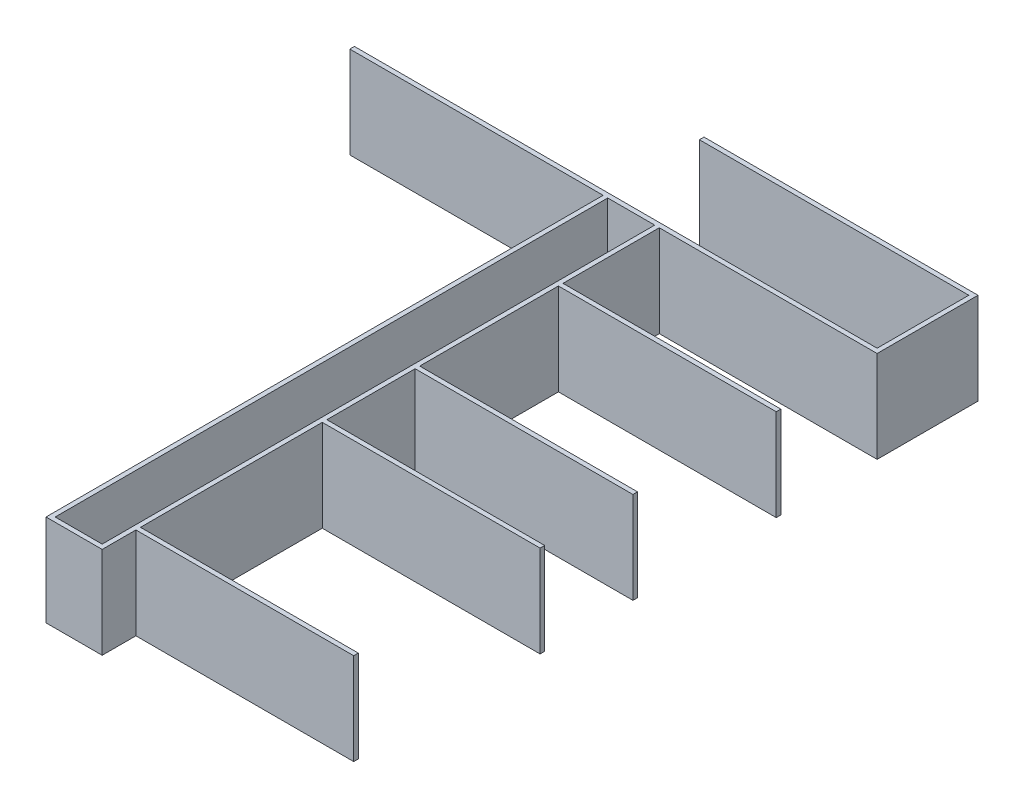
ISO-10303-21;
HEADER;
FILE_DESCRIPTION(('STEP AP214'),'2;1');
FILE_NAME('part.step','',(''),(''),'','','');
FILE_SCHEMA(('AUTOMOTIVE_DESIGN { 1 0 10303 214 1 1 1 1 }'));
ENDSEC;
DATA;
#1=APPLICATION_CONTEXT('core data for automotive mechanical design processes');
#2=APPLICATION_PROTOCOL_DEFINITION('international standard','automotive_design',2000,#1);
#3=PRODUCT_CONTEXT('',#1,'mechanical');
#4=PRODUCT('Part','Part','',(#3));
#5=PRODUCT_RELATED_PRODUCT_CATEGORY('part','',(#4));
#6=PRODUCT_DEFINITION_FORMATION('','',#4);
#7=PRODUCT_DEFINITION_CONTEXT('part definition',#1,'design');
#8=PRODUCT_DEFINITION('design','',#6,#7);
#9=PRODUCT_DEFINITION_SHAPE('','',#8);
#10=(LENGTH_UNIT() NAMED_UNIT(*) SI_UNIT(.MILLI.,.METRE.));
#11=(NAMED_UNIT(*) PLANE_ANGLE_UNIT() SI_UNIT($,.RADIAN.));
#12=(NAMED_UNIT(*) SI_UNIT($,.STERADIAN.) SOLID_ANGLE_UNIT());
#13=UNCERTAINTY_MEASURE_WITH_UNIT(LENGTH_MEASURE(1.E-05),#10,'distance_accuracy_value','');
#14=(GEOMETRIC_REPRESENTATION_CONTEXT(3) GLOBAL_UNCERTAINTY_ASSIGNED_CONTEXT((#13)) GLOBAL_UNIT_ASSIGNED_CONTEXT((#10,
#11,#12)) REPRESENTATION_CONTEXT('',''));
#15=CARTESIAN_POINT('',(0.,0.,0.));
#16=DIRECTION('',(0.,0.,1.));
#17=DIRECTION('',(1.,0.,0.));
#18=AXIS2_PLACEMENT_3D('',#15,#16,#17);
#19=CARTESIAN_POINT('',(0.,40.,0.));
#20=DIRECTION('',(-1.,0.,0.));
#21=DIRECTION('',(0.,0.,1.));
#22=AXIS2_PLACEMENT_3D('',#19,#20,#21);
#23=PLANE('',#22);
#24=DIRECTION('',(0.,-1.,0.));
#25=VECTOR('',#24,1.);
#26=CARTESIAN_POINT('',(0.,40.,-199.));
#27=LINE('',#26,#25);
#28=CARTESIAN_POINT('',(0.,40.,-199.));
#29=VERTEX_POINT('',#28);
#30=CARTESIAN_POINT('',(0.,0.,-199.));
#31=VERTEX_POINT('',#30);
#32=EDGE_CURVE('E12',#29,#31,#27,.T.);
#33=ORIENTED_EDGE('',*,*,#32,.F.);
#34=DIRECTION('',(0.,0.,-1.));
#35=VECTOR('',#34,1.);
#36=CARTESIAN_POINT('',(0.,40.,0.));
#37=LINE('',#36,#35);
#38=CARTESIAN_POINT('',(0.,40.,-138.5));
#39=VERTEX_POINT('',#38);
#40=EDGE_CURVE('E416',#39,#29,#37,.T.);
#41=ORIENTED_EDGE('',*,*,#40,.F.);
#42=DIRECTION('',(0.,-1.,0.));
#43=VECTOR('',#42,1.);
#44=CARTESIAN_POINT('',(0.,40.,-138.5));
#45=LINE('',#44,#43);
#46=CARTESIAN_POINT('',(0.,0.,-138.5));
#47=VERTEX_POINT('',#46);
#48=EDGE_CURVE('E508',#39,#47,#45,.T.);
#49=ORIENTED_EDGE('',*,*,#48,.T.);
#50=DIRECTION('',(0.,0.,-1.));
#51=VECTOR('',#50,1.);
#52=CARTESIAN_POINT('',(0.,0.,0.));
#53=LINE('',#52,#51);
#54=EDGE_CURVE('E479',#47,#31,#53,.T.);
#55=ORIENTED_EDGE('',*,*,#54,.T.);
#56=EDGE_LOOP('',(#33,#41,#49,#55));
#57=FACE_BOUND('',#56,.T.);
#58=ADVANCED_FACE('F131',(#57),#23,.F.);
#59=CARTESIAN_POINT('',(0.,40.,-245.));
#60=DIRECTION('',(0.,0.,1.));
#61=DIRECTION('',(1.,0.,0.));
#62=AXIS2_PLACEMENT_3D('',#59,#60,#61);
#63=PLANE('',#62);
#64=DIRECTION('',(-1.,0.,0.));
#65=VECTOR('',#64,1.);
#66=CARTESIAN_POINT('',(0.,0.,-245.));
#67=LINE('',#66,#65);
#68=CARTESIAN_POINT('',(93.,0.,-245.));
#69=VERTEX_POINT('',#68);
#70=CARTESIAN_POINT('',(-135.,0.,-245.));
#71=VERTEX_POINT('',#70);
#72=EDGE_CURVE('E430',#69,#71,#67,.T.);
#73=ORIENTED_EDGE('',*,*,#72,.T.);
#74=DIRECTION('',(0.,-1.,0.));
#75=VECTOR('',#74,1.);
#76=CARTESIAN_POINT('',(-135.,40.,-245.));
#77=LINE('',#76,#75);
#78=CARTESIAN_POINT('',(-135.,40.,-245.));
#79=VERTEX_POINT('',#78);
#80=EDGE_CURVE('E551',#79,#71,#77,.T.);
#81=ORIENTED_EDGE('',*,*,#80,.F.);
#82=DIRECTION('',(-1.,0.,0.));
#83=VECTOR('',#82,1.);
#84=CARTESIAN_POINT('',(0.,40.,-245.));
#85=LINE('',#84,#83);
#86=CARTESIAN_POINT('',(93.,40.,-245.));
#87=VERTEX_POINT('',#86);
#88=EDGE_CURVE('E367',#87,#79,#85,.T.);
#89=ORIENTED_EDGE('',*,*,#88,.F.);
#90=DIRECTION('',(0.,-1.,0.));
#91=VECTOR('',#90,1.);
#92=CARTESIAN_POINT('',(93.,40.,-245.));
#93=LINE('',#92,#91);
#94=EDGE_CURVE('E429',#87,#69,#93,.T.);
#95=ORIENTED_EDGE('',*,*,#94,.T.);
#96=EDGE_LOOP('',(#73,#81,#89,#95));
#97=FACE_BOUND('',#96,.T.);
#98=ADVANCED_FACE('F645',(#97),#63,.F.);
#99=CARTESIAN_POINT('',(-135.,40.,0.));
#100=DIRECTION('',(1.,0.,0.));
#101=DIRECTION('',(0.,0.,-1.));
#102=AXIS2_PLACEMENT_3D('',#99,#100,#101);
#103=PLANE('',#102);
#104=DIRECTION('',(0.,0.,1.));
#105=VECTOR('',#104,1.);
#106=CARTESIAN_POINT('',(-135.,0.,0.));
#107=LINE('',#106,#105);
#108=CARTESIAN_POINT('',(-135.,0.,-243.));
#109=VERTEX_POINT('',#108);
#110=EDGE_CURVE('E433',#71,#109,#107,.T.);
#111=ORIENTED_EDGE('',*,*,#110,.T.);
#112=DIRECTION('',(0.,-1.,0.));
#113=VECTOR('',#112,1.);
#114=CARTESIAN_POINT('',(-135.,40.,-243.));
#115=LINE('',#114,#113);
#116=CARTESIAN_POINT('',(-135.,40.,-243.));
#117=VERTEX_POINT('',#116);
#118=EDGE_CURVE('E549',#117,#109,#115,.T.);
#119=ORIENTED_EDGE('',*,*,#118,.F.);
#120=DIRECTION('',(0.,0.,1.));
#121=VECTOR('',#120,1.);
#122=CARTESIAN_POINT('',(-135.,40.,0.));
#123=LINE('',#122,#121);
#124=EDGE_CURVE('E370',#79,#117,#123,.T.);
#125=ORIENTED_EDGE('',*,*,#124,.F.);
#126=ORIENTED_EDGE('',*,*,#80,.T.);
#127=EDGE_LOOP('',(#111,#119,#125,#126));
#128=FACE_BOUND('',#127,.T.);
#129=ADVANCED_FACE('F647',(#128),#103,.F.);
#130=CARTESIAN_POINT('',(0.,40.,-243.));
#131=DIRECTION('',(0.,0.,1.));
#132=DIRECTION('',(1.,0.,0.));
#133=AXIS2_PLACEMENT_3D('',#130,#131,#132);
#134=PLANE('',#133);
#135=DIRECTION('',(-1.,0.,0.));
#136=VECTOR('',#135,1.);
#137=CARTESIAN_POINT('',(0.,0.,-243.));
#138=LINE('',#137,#136);
#139=CARTESIAN_POINT('',(-24.5,0.,-243.));
#140=VERTEX_POINT('',#139);
#141=EDGE_CURVE('E437',#140,#109,#138,.T.);
#142=ORIENTED_EDGE('',*,*,#141,.F.);
#143=DIRECTION('',(0.,-1.,0.));
#144=VECTOR('',#143,1.);
#145=CARTESIAN_POINT('',(-24.5,40.,-243.));
#146=LINE('',#145,#144);
#147=CARTESIAN_POINT('',(-24.5,40.,-243.));
#148=VERTEX_POINT('',#147);
#149=EDGE_CURVE('E547',#148,#140,#146,.T.);
#150=ORIENTED_EDGE('',*,*,#149,.F.);
#151=DIRECTION('',(-1.,0.,0.));
#152=VECTOR('',#151,1.);
#153=CARTESIAN_POINT('',(0.,40.,-243.));
#154=LINE('',#153,#152);
#155=EDGE_CURVE('E373',#148,#117,#154,.T.);
#156=ORIENTED_EDGE('',*,*,#155,.T.);
#157=ORIENTED_EDGE('',*,*,#118,.T.);
#158=EDGE_LOOP('',(#142,#150,#156,#157));
#159=FACE_BOUND('',#158,.T.);
#160=ADVANCED_FACE('F654',(#159),#134,.T.);
#161=CARTESIAN_POINT('',(-24.4999999999999,40.,0.));
#162=DIRECTION('',(1.,0.,0.));
#163=DIRECTION('',(0.,0.,-1.));
#164=AXIS2_PLACEMENT_3D('',#161,#162,#163);
#165=PLANE('',#164);
#166=DIRECTION('',(0.,0.,1.));
#167=VECTOR('',#166,1.);
#168=CARTESIAN_POINT('',(-24.4999999999999,0.,0.));
#169=LINE('',#168,#167);
#170=CARTESIAN_POINT('',(-24.4999999999999,0.,0.));
#171=VERTEX_POINT('',#170);
#172=EDGE_CURVE('E352',#140,#171,#169,.T.);
#173=ORIENTED_EDGE('',*,*,#172,.T.);
#174=DIRECTION('',(0.,-1.,0.));
#175=VECTOR('',#174,1.);
#176=CARTESIAN_POINT('',(-24.4999999999999,40.,0.));
#177=LINE('',#176,#175);
#178=CARTESIAN_POINT('',(-24.4999999999999,40.,0.));
#179=VERTEX_POINT('',#178);
#180=EDGE_CURVE('E544',#179,#171,#177,.T.);
#181=ORIENTED_EDGE('',*,*,#180,.F.);
#182=DIRECTION('',(0.,0.,1.));
#183=VECTOR('',#182,1.);
#184=CARTESIAN_POINT('',(-24.4999999999999,40.,0.));
#185=LINE('',#184,#183);
#186=EDGE_CURVE('E376',#148,#179,#185,.T.);
#187=ORIENTED_EDGE('',*,*,#186,.F.);
#188=ORIENTED_EDGE('',*,*,#149,.T.);
#189=EDGE_LOOP('',(#173,#181,#187,#188));
#190=FACE_BOUND('',#189,.T.);
#191=ADVANCED_FACE('F657',(#190),#165,.F.);
#192=CARTESIAN_POINT('',(-22.5,40.,0.));
#193=DIRECTION('',(-1.,0.,0.));
#194=DIRECTION('',(0.,0.,1.));
#195=AXIS2_PLACEMENT_3D('',#192,#193,#194);
#196=PLANE('',#195);
#197=DIRECTION('',(0.,0.,-1.));
#198=VECTOR('',#197,1.);
#199=CARTESIAN_POINT('',(-22.5,40.,0.));
#200=LINE('',#199,#198);
#201=CARTESIAN_POINT('',(-22.5,40.,-1.99999999999999));
#202=VERTEX_POINT('',#201);
#203=CARTESIAN_POINT('',(-22.5,40.,-243.));
#204=VERTEX_POINT('',#203);
#205=EDGE_CURVE('E156',#202,#204,#200,.T.);
#206=ORIENTED_EDGE('',*,*,#205,.F.);
#207=DIRECTION('',(0.,-1.,0.));
#208=VECTOR('',#207,1.);
#209=CARTESIAN_POINT('',(-22.5,40.,-1.99999999999999));
#210=LINE('',#209,#208);
#211=CARTESIAN_POINT('',(-22.5,0.,-1.99999999999999));
#212=VERTEX_POINT('',#211);
#213=EDGE_CURVE('E354',#202,#212,#210,.T.);
#214=ORIENTED_EDGE('',*,*,#213,.T.);
#215=DIRECTION('',(0.,0.,-1.));
#216=VECTOR('',#215,1.);
#217=CARTESIAN_POINT('',(-22.5,0.,0.));
#218=LINE('',#217,#216);
#219=CARTESIAN_POINT('',(-22.5,0.,-243.));
#220=VERTEX_POINT('',#219);
#221=EDGE_CURVE('E343',#212,#220,#218,.T.);
#222=ORIENTED_EDGE('',*,*,#221,.T.);
#223=DIRECTION('',(0.,-1.,0.));
#224=VECTOR('',#223,1.);
#225=CARTESIAN_POINT('',(-22.5,40.,-243.));
#226=LINE('',#225,#224);
#227=EDGE_CURVE('E542',#204,#220,#226,.T.);
#228=ORIENTED_EDGE('',*,*,#227,.F.);
#229=EDGE_LOOP('',(#206,#214,#222,#228));
#230=FACE_BOUND('',#229,.T.);
#231=ADVANCED_FACE('F355',(#230),#196,.F.);
#232=CARTESIAN_POINT('',(0.,40.,-243.));
#233=DIRECTION('',(0.,0.,1.));
#234=DIRECTION('',(1.,0.,0.));
#235=AXIS2_PLACEMENT_3D('',#232,#233,#234);
#236=PLANE('',#235);
#237=DIRECTION('',(-1.,0.,0.));
#238=VECTOR('',#237,1.);
#239=CARTESIAN_POINT('',(0.,0.,-243.));
#240=LINE('',#239,#238);
#241=CARTESIAN_POINT('',(-2.,0.,-243.));
#242=VERTEX_POINT('',#241);
#243=EDGE_CURVE('E350',#242,#220,#240,.T.);
#244=ORIENTED_EDGE('',*,*,#243,.F.);
#245=DIRECTION('',(0.,-1.,0.));
#246=VECTOR('',#245,1.);
#247=CARTESIAN_POINT('',(-2.,40.,-243.));
#248=LINE('',#247,#246);
#249=CARTESIAN_POINT('',(-2.,40.,-243.));
#250=VERTEX_POINT('',#249);
#251=EDGE_CURVE('E540',#250,#242,#248,.T.);
#252=ORIENTED_EDGE('',*,*,#251,.F.);
#253=DIRECTION('',(-1.,0.,0.));
#254=VECTOR('',#253,1.);
#255=CARTESIAN_POINT('',(0.,40.,-243.));
#256=LINE('',#255,#254);
#257=EDGE_CURVE('E382',#250,#204,#256,.T.);
#258=ORIENTED_EDGE('',*,*,#257,.T.);
#259=ORIENTED_EDGE('',*,*,#227,.T.);
#260=EDGE_LOOP('',(#244,#252,#258,#259));
#261=FACE_BOUND('',#260,.T.);
#262=ADVANCED_FACE('F708',(#261),#236,.T.);
#263=CARTESIAN_POINT('',(-1.99999999999997,40.,0.));
#264=DIRECTION('',(1.,0.,0.));
#265=DIRECTION('',(0.,0.,-1.));
#266=AXIS2_PLACEMENT_3D('',#263,#264,#265);
#267=PLANE('',#266);
#268=DIRECTION('',(0.,0.,1.));
#269=VECTOR('',#268,1.);
#270=CARTESIAN_POINT('',(-1.99999999999997,0.,0.));
#271=LINE('',#270,#269);
#272=CARTESIAN_POINT('',(-1.99999999999997,0.,-1.99999999999999));
#273=VERTEX_POINT('',#272);
#274=EDGE_CURVE('E443',#242,#273,#271,.T.);
#275=ORIENTED_EDGE('',*,*,#274,.T.);
#276=DIRECTION('',(0.,-1.,0.));
#277=VECTOR('',#276,1.);
#278=CARTESIAN_POINT('',(-1.99999999999997,40.,-1.99999999999999));
#279=LINE('',#278,#277);
#280=CARTESIAN_POINT('',(-1.99999999999997,40.,-1.99999999999999));
#281=VERTEX_POINT('',#280);
#282=EDGE_CURVE('E148',#281,#273,#279,.T.);
#283=ORIENTED_EDGE('',*,*,#282,.F.);
#284=DIRECTION('',(0.,0.,1.));
#285=VECTOR('',#284,1.);
#286=CARTESIAN_POINT('',(-1.99999999999997,40.,0.));
#287=LINE('',#286,#285);
#288=EDGE_CURVE('E385',#250,#281,#287,.T.);
#289=ORIENTED_EDGE('',*,*,#288,.F.);
#290=ORIENTED_EDGE('',*,*,#251,.T.);
#291=EDGE_LOOP('',(#275,#283,#289,#290));
#292=FACE_BOUND('',#291,.T.);
#293=ADVANCED_FACE('F711',(#292),#267,.F.);
#294=CARTESIAN_POINT('',(0.,40.,0.));
#295=DIRECTION('',(0.,0.,1.));
#296=DIRECTION('',(1.,0.,0.));
#297=AXIS2_PLACEMENT_3D('',#294,#295,#296);
#298=PLANE('',#297);
#299=DIRECTION('',(-1.,0.,0.));
#300=VECTOR('',#299,1.);
#301=CARTESIAN_POINT('',(0.,0.,0.));
#302=LINE('',#301,#300);
#303=CARTESIAN_POINT('',(0.,0.,0.));
#304=VERTEX_POINT('',#303);
#305=EDGE_CURVE('E445',#304,#171,#302,.T.);
#306=ORIENTED_EDGE('',*,*,#305,.F.);
#307=DIRECTION('',(0.,-1.,0.));
#308=VECTOR('',#307,1.);
#309=CARTESIAN_POINT('',(0.,40.,0.));
#310=LINE('',#309,#308);
#311=CARTESIAN_POINT('',(0.,40.,0.));
#312=VERTEX_POINT('',#311);
#313=EDGE_CURVE('E538',#312,#304,#310,.T.);
#314=ORIENTED_EDGE('',*,*,#313,.F.);
#315=DIRECTION('',(-1.,0.,0.));
#316=VECTOR('',#315,1.);
#317=CARTESIAN_POINT('',(0.,40.,0.));
#318=LINE('',#317,#316);
#319=EDGE_CURVE('E378',#312,#179,#318,.T.);
#320=ORIENTED_EDGE('',*,*,#319,.T.);
#321=ORIENTED_EDGE('',*,*,#180,.T.);
#322=EDGE_LOOP('',(#306,#314,#320,#321));
#323=FACE_BOUND('',#322,.T.);
#324=ADVANCED_FACE('F661',(#323),#298,.T.);
#325=CARTESIAN_POINT('',(0.,0.,-14.7));
#326=VERTEX_POINT('',#325);
#327=EDGE_CURVE('E447',#304,#326,#53,.T.);
#328=ORIENTED_EDGE('',*,*,#327,.T.);
#329=DIRECTION('',(0.,-1.,0.));
#330=VECTOR('',#329,1.);
#331=CARTESIAN_POINT('',(0.,40.,-14.7));
#332=LINE('',#331,#330);
#333=CARTESIAN_POINT('',(0.,40.,-14.7));
#334=VERTEX_POINT('',#333);
#335=EDGE_CURVE('E535',#334,#326,#332,.T.);
#336=ORIENTED_EDGE('',*,*,#335,.F.);
#337=EDGE_CURVE('E387',#312,#334,#37,.T.);
#338=ORIENTED_EDGE('',*,*,#337,.F.);
#339=ORIENTED_EDGE('',*,*,#313,.T.);
#340=EDGE_LOOP('',(#328,#336,#338,#339));
#341=FACE_BOUND('',#340,.T.);
#342=ADVANCED_FACE('F667',(#341),#23,.F.);
#343=CARTESIAN_POINT('',(0.,40.,-14.7));
#344=DIRECTION('',(0.,0.,-1.));
#345=DIRECTION('',(-1.,0.,0.));
#346=AXIS2_PLACEMENT_3D('',#343,#344,#345);
#347=PLANE('',#346);
#348=DIRECTION('',(1.,0.,0.));
#349=VECTOR('',#348,1.);
#350=CARTESIAN_POINT('',(0.,0.,-14.7));
#351=LINE('',#350,#349);
#352=CARTESIAN_POINT('',(95.,0.,-14.7));
#353=VERTEX_POINT('',#352);
#354=EDGE_CURVE('E449',#326,#353,#351,.T.);
#355=ORIENTED_EDGE('',*,*,#354,.T.);
#356=DIRECTION('',(0.,-1.,0.));
#357=VECTOR('',#356,1.);
#358=CARTESIAN_POINT('',(95.,40.,-14.7));
#359=LINE('',#358,#357);
#360=CARTESIAN_POINT('',(95.,40.,-14.7));
#361=VERTEX_POINT('',#360);
#362=EDGE_CURVE('E532',#361,#353,#359,.T.);
#363=ORIENTED_EDGE('',*,*,#362,.F.);
#364=DIRECTION('',(1.,0.,0.));
#365=VECTOR('',#364,1.);
#366=CARTESIAN_POINT('',(0.,40.,-14.7));
#367=LINE('',#366,#365);
#368=EDGE_CURVE('E389',#334,#361,#367,.T.);
#369=ORIENTED_EDGE('',*,*,#368,.F.);
#370=ORIENTED_EDGE('',*,*,#335,.T.);
#371=EDGE_LOOP('',(#355,#363,#369,#370));
#372=FACE_BOUND('',#371,.T.);
#373=ADVANCED_FACE('F671',(#372),#347,.F.);
#374=CARTESIAN_POINT('',(95.,40.,0.));
#375=DIRECTION('',(-1.,0.,0.));
#376=DIRECTION('',(0.,0.,1.));
#377=AXIS2_PLACEMENT_3D('',#374,#375,#376);
#378=PLANE('',#377);
#379=DIRECTION('',(0.,0.,-1.));
#380=VECTOR('',#379,1.);
#381=CARTESIAN_POINT('',(95.,0.,0.));
#382=LINE('',#381,#380);
#383=CARTESIAN_POINT('',(95.,0.,-16.7));
#384=VERTEX_POINT('',#383);
#385=EDGE_CURVE('E453',#353,#384,#382,.T.);
#386=ORIENTED_EDGE('',*,*,#385,.T.);
#387=DIRECTION('',(0.,-1.,0.));
#388=VECTOR('',#387,1.);
#389=CARTESIAN_POINT('',(95.,40.,-16.7));
#390=LINE('',#389,#388);
#391=CARTESIAN_POINT('',(95.,40.,-16.7));
#392=VERTEX_POINT('',#391);
#393=EDGE_CURVE('E530',#392,#384,#390,.T.);
#394=ORIENTED_EDGE('',*,*,#393,.F.);
#395=DIRECTION('',(0.,0.,-1.));
#396=VECTOR('',#395,1.);
#397=CARTESIAN_POINT('',(95.,40.,0.));
#398=LINE('',#397,#396);
#399=EDGE_CURVE('E393',#361,#392,#398,.T.);
#400=ORIENTED_EDGE('',*,*,#399,.F.);
#401=ORIENTED_EDGE('',*,*,#362,.T.);
#402=EDGE_LOOP('',(#386,#394,#400,#401));
#403=FACE_BOUND('',#402,.T.);
#404=ADVANCED_FACE('F676',(#403),#378,.F.);
#405=CARTESIAN_POINT('',(0.,40.,-16.7));
#406=DIRECTION('',(0.,0.,-1.));
#407=DIRECTION('',(-1.,0.,0.));
#408=AXIS2_PLACEMENT_3D('',#405,#406,#407);
#409=PLANE('',#408);
#410=DIRECTION('',(1.,0.,0.));
#411=VECTOR('',#410,1.);
#412=CARTESIAN_POINT('',(0.,0.,-16.7));
#413=LINE('',#412,#411);
#414=CARTESIAN_POINT('',(0.,0.,-16.7));
#415=VERTEX_POINT('',#414);
#416=EDGE_CURVE('E456',#415,#384,#413,.T.);
#417=ORIENTED_EDGE('',*,*,#416,.F.);
#418=DIRECTION('',(0.,-1.,0.));
#419=VECTOR('',#418,1.);
#420=CARTESIAN_POINT('',(0.,40.,-16.7));
#421=LINE('',#420,#419);
#422=CARTESIAN_POINT('',(0.,40.,-16.7));
#423=VERTEX_POINT('',#422);
#424=EDGE_CURVE('E528',#423,#415,#421,.T.);
#425=ORIENTED_EDGE('',*,*,#424,.F.);
#426=DIRECTION('',(1.,0.,0.));
#427=VECTOR('',#426,1.);
#428=CARTESIAN_POINT('',(0.,40.,-16.7));
#429=LINE('',#428,#427);
#430=EDGE_CURVE('E395',#423,#392,#429,.T.);
#431=ORIENTED_EDGE('',*,*,#430,.T.);
#432=ORIENTED_EDGE('',*,*,#393,.T.);
#433=EDGE_LOOP('',(#417,#425,#431,#432));
#434=FACE_BOUND('',#433,.T.);
#435=ADVANCED_FACE('F678',(#434),#409,.T.);
#436=CARTESIAN_POINT('',(0.,0.,-96.));
#437=VERTEX_POINT('',#436);
#438=EDGE_CURVE('E451',#415,#437,#53,.T.);
#439=ORIENTED_EDGE('',*,*,#438,.T.);
#440=DIRECTION('',(0.,-1.,0.));
#441=VECTOR('',#440,1.);
#442=CARTESIAN_POINT('',(0.,40.,-96.));
#443=LINE('',#442,#441);
#444=CARTESIAN_POINT('',(0.,40.,-96.));
#445=VERTEX_POINT('',#444);
#446=EDGE_CURVE('E525',#445,#437,#443,.T.);
#447=ORIENTED_EDGE('',*,*,#446,.F.);
#448=EDGE_CURVE('E391',#423,#445,#37,.T.);
#449=ORIENTED_EDGE('',*,*,#448,.F.);
#450=ORIENTED_EDGE('',*,*,#424,.T.);
#451=EDGE_LOOP('',(#439,#447,#449,#450));
#452=FACE_BOUND('',#451,.T.);
#453=ADVANCED_FACE('F594',(#452),#23,.F.);
#454=CARTESIAN_POINT('',(0.,40.,-96.));
#455=DIRECTION('',(0.,0.,-1.));
#456=DIRECTION('',(-1.,0.,0.));
#457=AXIS2_PLACEMENT_3D('',#454,#455,#456);
#458=PLANE('',#457);
#459=DIRECTION('',(1.,0.,0.));
#460=VECTOR('',#459,1.);
#461=CARTESIAN_POINT('',(0.,0.,-96.));
#462=LINE('',#461,#460);
#463=CARTESIAN_POINT('',(95.,0.,-96.));
#464=VERTEX_POINT('',#463);
#465=EDGE_CURVE('E459',#437,#464,#462,.T.);
#466=ORIENTED_EDGE('',*,*,#465,.T.);
#467=DIRECTION('',(0.,-1.,0.));
#468=VECTOR('',#467,1.);
#469=CARTESIAN_POINT('',(95.,40.,-96.));
#470=LINE('',#469,#468);
#471=CARTESIAN_POINT('',(95.,40.,-96.));
#472=VERTEX_POINT('',#471);
#473=EDGE_CURVE('E522',#472,#464,#470,.T.);
#474=ORIENTED_EDGE('',*,*,#473,.F.);
#475=DIRECTION('',(1.,0.,0.));
#476=VECTOR('',#475,1.);
#477=CARTESIAN_POINT('',(0.,40.,-96.));
#478=LINE('',#477,#476);
#479=EDGE_CURVE('E398',#445,#472,#478,.T.);
#480=ORIENTED_EDGE('',*,*,#479,.F.);
#481=ORIENTED_EDGE('',*,*,#446,.T.);
#482=EDGE_LOOP('',(#466,#474,#480,#481));
#483=FACE_BOUND('',#482,.T.);
#484=ADVANCED_FACE('F600',(#483),#458,.F.);
#485=CARTESIAN_POINT('',(95.,40.,0.));
#486=DIRECTION('',(-1.,0.,0.));
#487=DIRECTION('',(0.,0.,1.));
#488=AXIS2_PLACEMENT_3D('',#485,#486,#487);
#489=PLANE('',#488);
#490=DIRECTION('',(0.,0.,-1.));
#491=VECTOR('',#490,1.);
#492=CARTESIAN_POINT('',(95.,0.,0.));
#493=LINE('',#492,#491);
#494=CARTESIAN_POINT('',(95.,0.,-98.));
#495=VERTEX_POINT('',#494);
#496=EDGE_CURVE('E461',#464,#495,#493,.T.);
#497=ORIENTED_EDGE('',*,*,#496,.T.);
#498=DIRECTION('',(0.,-1.,0.));
#499=VECTOR('',#498,1.);
#500=CARTESIAN_POINT('',(95.,40.,-98.));
#501=LINE('',#500,#499);
#502=CARTESIAN_POINT('',(95.,40.,-98.));
#503=VERTEX_POINT('',#502);
#504=EDGE_CURVE('E520',#503,#495,#501,.T.);
#505=ORIENTED_EDGE('',*,*,#504,.F.);
#506=DIRECTION('',(0.,0.,-1.));
#507=VECTOR('',#506,1.);
#508=CARTESIAN_POINT('',(95.,40.,0.));
#509=LINE('',#508,#507);
#510=EDGE_CURVE('E400',#472,#503,#509,.T.);
#511=ORIENTED_EDGE('',*,*,#510,.F.);
#512=ORIENTED_EDGE('',*,*,#473,.T.);
#513=EDGE_LOOP('',(#497,#505,#511,#512));
#514=FACE_BOUND('',#513,.T.);
#515=ADVANCED_FACE('F606',(#514),#489,.F.);
#516=CARTESIAN_POINT('',(0.,40.,-98.));
#517=DIRECTION('',(0.,0.,-1.));
#518=DIRECTION('',(-1.,0.,0.));
#519=AXIS2_PLACEMENT_3D('',#516,#517,#518);
#520=PLANE('',#519);
#521=DIRECTION('',(1.,0.,0.));
#522=VECTOR('',#521,1.);
#523=CARTESIAN_POINT('',(0.,0.,-98.));
#524=LINE('',#523,#522);
#525=CARTESIAN_POINT('',(0.,0.,-98.));
#526=VERTEX_POINT('',#525);
#527=EDGE_CURVE('E464',#526,#495,#524,.T.);
#528=ORIENTED_EDGE('',*,*,#527,.F.);
#529=DIRECTION('',(0.,-1.,0.));
#530=VECTOR('',#529,1.);
#531=CARTESIAN_POINT('',(0.,40.,-98.));
#532=LINE('',#531,#530);
#533=CARTESIAN_POINT('',(0.,40.,-98.));
#534=VERTEX_POINT('',#533);
#535=EDGE_CURVE('E518',#534,#526,#532,.T.);
#536=ORIENTED_EDGE('',*,*,#535,.F.);
#537=DIRECTION('',(1.,0.,0.));
#538=VECTOR('',#537,1.);
#539=CARTESIAN_POINT('',(0.,40.,-98.));
#540=LINE('',#539,#538);
#541=EDGE_CURVE('E402',#534,#503,#540,.T.);
#542=ORIENTED_EDGE('',*,*,#541,.T.);
#543=ORIENTED_EDGE('',*,*,#504,.T.);
#544=EDGE_LOOP('',(#528,#536,#542,#543));
#545=FACE_BOUND('',#544,.T.);
#546=ADVANCED_FACE('F727',(#545),#520,.T.);
#547=CARTESIAN_POINT('',(0.,0.,-136.5));
#548=VERTEX_POINT('',#547);
#549=EDGE_CURVE('E467',#526,#548,#53,.T.);
#550=ORIENTED_EDGE('',*,*,#549,.T.);
#551=DIRECTION('',(0.,-1.,0.));
#552=VECTOR('',#551,1.);
#553=CARTESIAN_POINT('',(0.,40.,-136.5));
#554=LINE('',#553,#552);
#555=CARTESIAN_POINT('',(0.,40.,-136.5));
#556=VERTEX_POINT('',#555);
#557=EDGE_CURVE('E515',#556,#548,#554,.T.);
#558=ORIENTED_EDGE('',*,*,#557,.F.);
#559=EDGE_CURVE('E405',#534,#556,#37,.T.);
#560=ORIENTED_EDGE('',*,*,#559,.F.);
#561=ORIENTED_EDGE('',*,*,#535,.T.);
#562=EDGE_LOOP('',(#550,#558,#560,#561));
#563=FACE_BOUND('',#562,.T.);
#564=ADVANCED_FACE('F730',(#563),#23,.F.);
#565=CARTESIAN_POINT('',(0.,40.,-136.5));
#566=DIRECTION('',(0.,0.,-1.));
#567=DIRECTION('',(-1.,0.,0.));
#568=AXIS2_PLACEMENT_3D('',#565,#566,#567);
#569=PLANE('',#568);
#570=DIRECTION('',(1.,0.,0.));
#571=VECTOR('',#570,1.);
#572=CARTESIAN_POINT('',(0.,0.,-136.5));
#573=LINE('',#572,#571);
#574=CARTESIAN_POINT('',(95.,0.,-136.5));
#575=VERTEX_POINT('',#574);
#576=EDGE_CURVE('E468',#548,#575,#573,.T.);
#577=ORIENTED_EDGE('',*,*,#576,.T.);
#578=DIRECTION('',(0.,-1.,0.));
#579=VECTOR('',#578,1.);
#580=CARTESIAN_POINT('',(95.,40.,-136.5));
#581=LINE('',#580,#579);
#582=CARTESIAN_POINT('',(95.,40.,-136.5));
#583=VERTEX_POINT('',#582);
#584=EDGE_CURVE('E512',#583,#575,#581,.T.);
#585=ORIENTED_EDGE('',*,*,#584,.F.);
#586=DIRECTION('',(1.,0.,0.));
#587=VECTOR('',#586,1.);
#588=CARTESIAN_POINT('',(0.,40.,-136.5));
#589=LINE('',#588,#587);
#590=EDGE_CURVE('E406',#556,#583,#589,.T.);
#591=ORIENTED_EDGE('',*,*,#590,.F.);
#592=ORIENTED_EDGE('',*,*,#557,.T.);
#593=EDGE_LOOP('',(#577,#585,#591,#592));
#594=FACE_BOUND('',#593,.T.);
#595=ADVANCED_FACE('F732',(#594),#569,.F.);
#596=CARTESIAN_POINT('',(95.,40.,0.));
#597=DIRECTION('',(-1.,0.,0.));
#598=DIRECTION('',(0.,0.,1.));
#599=AXIS2_PLACEMENT_3D('',#596,#597,#598);
#600=PLANE('',#599);
#601=DIRECTION('',(0.,0.,-1.));
#602=VECTOR('',#601,1.);
#603=CARTESIAN_POINT('',(95.,0.,0.));
#604=LINE('',#603,#602);
#605=CARTESIAN_POINT('',(95.,0.,-138.5));
#606=VERTEX_POINT('',#605);
#607=EDGE_CURVE('E470',#575,#606,#604,.T.);
#608=ORIENTED_EDGE('',*,*,#607,.T.);
#609=DIRECTION('',(0.,-1.,0.));
#610=VECTOR('',#609,1.);
#611=CARTESIAN_POINT('',(95.,40.,-138.5));
#612=LINE('',#611,#610);
#613=CARTESIAN_POINT('',(95.,40.,-138.5));
#614=VERTEX_POINT('',#613);
#615=EDGE_CURVE('E510',#614,#606,#612,.T.);
#616=ORIENTED_EDGE('',*,*,#615,.F.);
#617=DIRECTION('',(0.,0.,-1.));
#618=VECTOR('',#617,1.);
#619=CARTESIAN_POINT('',(95.,40.,0.));
#620=LINE('',#619,#618);
#621=EDGE_CURVE('E408',#583,#614,#620,.T.);
#622=ORIENTED_EDGE('',*,*,#621,.F.);
#623=ORIENTED_EDGE('',*,*,#584,.T.);
#624=EDGE_LOOP('',(#608,#616,#622,#623));
#625=FACE_BOUND('',#624,.T.);
#626=ADVANCED_FACE('F735',(#625),#600,.F.);
#627=CARTESIAN_POINT('',(0.,40.,-138.5));
#628=DIRECTION('',(0.,0.,-1.));
#629=DIRECTION('',(-1.,0.,0.));
#630=AXIS2_PLACEMENT_3D('',#627,#628,#629);
#631=PLANE('',#630);
#632=DIRECTION('',(1.,0.,0.));
#633=VECTOR('',#632,1.);
#634=CARTESIAN_POINT('',(0.,0.,-138.5));
#635=LINE('',#634,#633);
#636=EDGE_CURVE('E473',#47,#606,#635,.T.);
#637=ORIENTED_EDGE('',*,*,#636,.F.);
#638=ORIENTED_EDGE('',*,*,#48,.F.);
#639=DIRECTION('',(1.,0.,0.));
#640=VECTOR('',#639,1.);
#641=CARTESIAN_POINT('',(0.,40.,-138.5));
#642=LINE('',#641,#640);
#643=EDGE_CURVE('E410',#39,#614,#642,.T.);
#644=ORIENTED_EDGE('',*,*,#643,.T.);
#645=ORIENTED_EDGE('',*,*,#615,.T.);
#646=EDGE_LOOP('',(#637,#638,#644,#645));
#647=FACE_BOUND('',#646,.T.);
#648=ADVANCED_FACE('F739',(#647),#631,.T.);
#649=CARTESIAN_POINT('',(0.,40.,-201.));
#650=VERTEX_POINT('',#649);
#651=CARTESIAN_POINT('',(0.,40.,-243.));
#652=VERTEX_POINT('',#651);
#653=EDGE_CURVE('E390',#650,#652,#37,.T.);
#654=ORIENTED_EDGE('',*,*,#653,.F.);
#655=DIRECTION('',(0.,-1.,0.));
#656=VECTOR('',#655,1.);
#657=CARTESIAN_POINT('',(0.,40.,-201.));
#658=LINE('',#657,#656);
#659=CARTESIAN_POINT('',(0.,0.,-201.));
#660=VERTEX_POINT('',#659);
#661=EDGE_CURVE('E140',#650,#660,#658,.T.);
#662=ORIENTED_EDGE('',*,*,#661,.T.);
#663=CARTESIAN_POINT('',(0.,0.,-243.));
#664=VERTEX_POINT('',#663);
#665=EDGE_CURVE('E450',#660,#664,#53,.T.);
#666=ORIENTED_EDGE('',*,*,#665,.T.);
#667=DIRECTION('',(0.,-1.,0.));
#668=VECTOR('',#667,1.);
#669=CARTESIAN_POINT('',(0.,40.,-243.));
#670=LINE('',#669,#668);
#671=EDGE_CURVE('E505',#652,#664,#670,.T.);
#672=ORIENTED_EDGE('',*,*,#671,.F.);
#673=EDGE_LOOP('',(#654,#662,#666,#672));
#674=FACE_BOUND('',#673,.T.);
#675=ADVANCED_FACE('F619',(#674),#23,.F.);
#676=CARTESIAN_POINT('',(0.,40.,-243.));
#677=DIRECTION('',(0.,0.,-1.));
#678=DIRECTION('',(-1.,0.,0.));
#679=AXIS2_PLACEMENT_3D('',#676,#677,#678);
#680=PLANE('',#679);
#681=DIRECTION('',(1.,0.,0.));
#682=VECTOR('',#681,1.);
#683=CARTESIAN_POINT('',(0.,0.,-243.));
#684=LINE('',#683,#682);
#685=CARTESIAN_POINT('',(95.,0.,-243.));
#686=VERTEX_POINT('',#685);
#687=EDGE_CURVE('E476',#664,#686,#684,.T.);
#688=ORIENTED_EDGE('',*,*,#687,.T.);
#689=DIRECTION('',(0.,-1.,0.));
#690=VECTOR('',#689,1.);
#691=CARTESIAN_POINT('',(95.,40.,-243.));
#692=LINE('',#691,#690);
#693=CARTESIAN_POINT('',(95.,40.,-243.));
#694=VERTEX_POINT('',#693);
#695=EDGE_CURVE('E502',#694,#686,#692,.T.);
#696=ORIENTED_EDGE('',*,*,#695,.F.);
#697=DIRECTION('',(1.,0.,0.));
#698=VECTOR('',#697,1.);
#699=CARTESIAN_POINT('',(0.,40.,-243.));
#700=LINE('',#699,#698);
#701=EDGE_CURVE('E413',#652,#694,#700,.T.);
#702=ORIENTED_EDGE('',*,*,#701,.F.);
#703=ORIENTED_EDGE('',*,*,#671,.T.);
#704=EDGE_LOOP('',(#688,#696,#702,#703));
#705=FACE_BOUND('',#704,.T.);
#706=ADVANCED_FACE('F621',(#705),#680,.F.);
#707=CARTESIAN_POINT('',(95.,40.,0.));
#708=DIRECTION('',(-1.,0.,0.));
#709=DIRECTION('',(0.,0.,1.));
#710=AXIS2_PLACEMENT_3D('',#707,#708,#709);
#711=PLANE('',#710);
#712=DIRECTION('',(0.,0.,-1.));
#713=VECTOR('',#712,1.);
#714=CARTESIAN_POINT('',(95.,0.,0.));
#715=LINE('',#714,#713);
#716=CARTESIAN_POINT('',(95.,0.,-287.));
#717=VERTEX_POINT('',#716);
#718=EDGE_CURVE('E478',#686,#717,#715,.T.);
#719=ORIENTED_EDGE('',*,*,#718,.T.);
#720=DIRECTION('',(0.,-1.,0.));
#721=VECTOR('',#720,1.);
#722=CARTESIAN_POINT('',(95.,40.,-287.));
#723=LINE('',#722,#721);
#724=CARTESIAN_POINT('',(95.,40.,-287.));
#725=VERTEX_POINT('',#724);
#726=EDGE_CURVE('E500',#725,#717,#723,.T.);
#727=ORIENTED_EDGE('',*,*,#726,.F.);
#728=DIRECTION('',(0.,0.,-1.));
#729=VECTOR('',#728,1.);
#730=CARTESIAN_POINT('',(95.,40.,0.));
#731=LINE('',#730,#729);
#732=EDGE_CURVE('E415',#694,#725,#731,.T.);
#733=ORIENTED_EDGE('',*,*,#732,.F.);
#734=ORIENTED_EDGE('',*,*,#695,.T.);
#735=EDGE_LOOP('',(#719,#727,#733,#734));
#736=FACE_BOUND('',#735,.T.);
#737=ADVANCED_FACE('F625',(#736),#711,.F.);
#738=CARTESIAN_POINT('',(0.,40.,-287.));
#739=DIRECTION('',(0.,0.,-1.));
#740=DIRECTION('',(-1.,0.,0.));
#741=AXIS2_PLACEMENT_3D('',#738,#739,#740);
#742=PLANE('',#741);
#743=DIRECTION('',(1.,0.,0.));
#744=VECTOR('',#743,1.);
#745=CARTESIAN_POINT('',(0.,0.,-287.));
#746=LINE('',#745,#744);
#747=CARTESIAN_POINT('',(-24.5,0.,-287.));
#748=VERTEX_POINT('',#747);
#749=EDGE_CURVE('E482',#748,#717,#746,.T.);
#750=ORIENTED_EDGE('',*,*,#749,.F.);
#751=DIRECTION('',(0.,-1.,0.));
#752=VECTOR('',#751,1.);
#753=CARTESIAN_POINT('',(-24.5,40.,-287.));
#754=LINE('',#753,#752);
#755=CARTESIAN_POINT('',(-24.5,40.,-287.));
#756=VERTEX_POINT('',#755);
#757=EDGE_CURVE('E498',#756,#748,#754,.T.);
#758=ORIENTED_EDGE('',*,*,#757,.F.);
#759=DIRECTION('',(1.,0.,0.));
#760=VECTOR('',#759,1.);
#761=CARTESIAN_POINT('',(0.,40.,-287.));
#762=LINE('',#761,#760);
#763=EDGE_CURVE('E418',#756,#725,#762,.T.);
#764=ORIENTED_EDGE('',*,*,#763,.T.);
#765=ORIENTED_EDGE('',*,*,#726,.T.);
#766=EDGE_LOOP('',(#750,#758,#764,#765));
#767=FACE_BOUND('',#766,.T.);
#768=ADVANCED_FACE('F679',(#767),#742,.T.);
#769=CARTESIAN_POINT('',(-24.5,40.,0.));
#770=DIRECTION('',(-1.,0.,0.));
#771=DIRECTION('',(0.,0.,1.));
#772=AXIS2_PLACEMENT_3D('',#769,#770,#771);
#773=PLANE('',#772);
#774=DIRECTION('',(0.,0.,-1.));
#775=VECTOR('',#774,1.);
#776=CARTESIAN_POINT('',(-24.5,0.,0.));
#777=LINE('',#776,#775);
#778=CARTESIAN_POINT('',(-24.5,0.,-285.));
#779=VERTEX_POINT('',#778);
#780=EDGE_CURVE('E485',#779,#748,#777,.T.);
#781=ORIENTED_EDGE('',*,*,#780,.F.);
#782=DIRECTION('',(0.,-1.,0.));
#783=VECTOR('',#782,1.);
#784=CARTESIAN_POINT('',(-24.5,40.,-285.));
#785=LINE('',#784,#783);
#786=CARTESIAN_POINT('',(-24.5,40.,-285.));
#787=VERTEX_POINT('',#786);
#788=EDGE_CURVE('E496',#787,#779,#785,.T.);
#789=ORIENTED_EDGE('',*,*,#788,.F.);
#790=DIRECTION('',(0.,0.,-1.));
#791=VECTOR('',#790,1.);
#792=CARTESIAN_POINT('',(-24.5,40.,0.));
#793=LINE('',#792,#791);
#794=EDGE_CURVE('E421',#787,#756,#793,.T.);
#795=ORIENTED_EDGE('',*,*,#794,.T.);
#796=ORIENTED_EDGE('',*,*,#757,.T.);
#797=EDGE_LOOP('',(#781,#789,#795,#796));
#798=FACE_BOUND('',#797,.T.);
#799=ADVANCED_FACE('F632',(#798),#773,.T.);
#800=CARTESIAN_POINT('',(0.,40.,-285.));
#801=DIRECTION('',(0.,0.,1.));
#802=DIRECTION('',(1.,0.,0.));
#803=AXIS2_PLACEMENT_3D('',#800,#801,#802);
#804=PLANE('',#803);
#805=DIRECTION('',(-1.,0.,0.));
#806=VECTOR('',#805,1.);
#807=CARTESIAN_POINT('',(0.,0.,-285.));
#808=LINE('',#807,#806);
#809=CARTESIAN_POINT('',(93.,0.,-285.));
#810=VERTEX_POINT('',#809);
#811=EDGE_CURVE('E488',#810,#779,#808,.T.);
#812=ORIENTED_EDGE('',*,*,#811,.F.);
#813=DIRECTION('',(0.,-1.,0.));
#814=VECTOR('',#813,1.);
#815=CARTESIAN_POINT('',(93.,40.,-285.));
#816=LINE('',#815,#814);
#817=CARTESIAN_POINT('',(93.,40.,-285.));
#818=VERTEX_POINT('',#817);
#819=EDGE_CURVE('E494',#818,#810,#816,.T.);
#820=ORIENTED_EDGE('',*,*,#819,.F.);
#821=DIRECTION('',(-1.,0.,0.));
#822=VECTOR('',#821,1.);
#823=CARTESIAN_POINT('',(0.,40.,-285.));
#824=LINE('',#823,#822);
#825=EDGE_CURVE('E424',#818,#787,#824,.T.);
#826=ORIENTED_EDGE('',*,*,#825,.T.);
#827=ORIENTED_EDGE('',*,*,#788,.T.);
#828=EDGE_LOOP('',(#812,#820,#826,#827));
#829=FACE_BOUND('',#828,.T.);
#830=ADVANCED_FACE('F636',(#829),#804,.T.);
#831=CARTESIAN_POINT('',(93.,40.,0.));
#832=DIRECTION('',(1.,0.,0.));
#833=DIRECTION('',(0.,0.,-1.));
#834=AXIS2_PLACEMENT_3D('',#831,#832,#833);
#835=PLANE('',#834);
#836=DIRECTION('',(0.,0.,1.));
#837=VECTOR('',#836,1.);
#838=CARTESIAN_POINT('',(93.,0.,0.));
#839=LINE('',#838,#837);
#840=EDGE_CURVE('E371',#810,#69,#839,.T.);
#841=ORIENTED_EDGE('',*,*,#840,.T.);
#842=ORIENTED_EDGE('',*,*,#94,.F.);
#843=DIRECTION('',(0.,0.,1.));
#844=VECTOR('',#843,1.);
#845=CARTESIAN_POINT('',(93.,40.,0.));
#846=LINE('',#845,#844);
#847=EDGE_CURVE('E427',#818,#87,#846,.T.);
#848=ORIENTED_EDGE('',*,*,#847,.F.);
#849=ORIENTED_EDGE('',*,*,#819,.T.);
#850=EDGE_LOOP('',(#841,#842,#848,#849));
#851=FACE_BOUND('',#850,.T.);
#852=ADVANCED_FACE('F642',(#851),#835,.F.);
#853=CARTESIAN_POINT('',(0.,40.,0.));
#854=DIRECTION('',(0.,1.,0.));
#855=DIRECTION('',(0.,0.,1.));
#856=AXIS2_PLACEMENT_3D('',#853,#854,#855);
#857=PLANE('',#856);
#858=DIRECTION('',(1.,0.,0.));
#859=VECTOR('',#858,1.);
#860=CARTESIAN_POINT('',(0.,40.,-1.99999999999999));
#861=LINE('',#860,#859);
#862=EDGE_CURVE('E362',#202,#281,#861,.T.);
#863=ORIENTED_EDGE('',*,*,#862,.F.);
#864=ORIENTED_EDGE('',*,*,#205,.T.);
#865=ORIENTED_EDGE('',*,*,#257,.F.);
#866=ORIENTED_EDGE('',*,*,#288,.T.);
#867=EDGE_LOOP('',(#863,#864,#865,#866));
#868=FACE_BOUND('',#867,.T.);
#869=ORIENTED_EDGE('',*,*,#88,.T.);
#870=ORIENTED_EDGE('',*,*,#124,.T.);
#871=ORIENTED_EDGE('',*,*,#155,.F.);
#872=ORIENTED_EDGE('',*,*,#186,.T.);
#873=ORIENTED_EDGE('',*,*,#319,.F.);
#874=ORIENTED_EDGE('',*,*,#337,.T.);
#875=ORIENTED_EDGE('',*,*,#368,.T.);
#876=ORIENTED_EDGE('',*,*,#399,.T.);
#877=ORIENTED_EDGE('',*,*,#430,.F.);
#878=ORIENTED_EDGE('',*,*,#448,.T.);
#879=ORIENTED_EDGE('',*,*,#479,.T.);
#880=ORIENTED_EDGE('',*,*,#510,.T.);
#881=ORIENTED_EDGE('',*,*,#541,.F.);
#882=ORIENTED_EDGE('',*,*,#559,.T.);
#883=ORIENTED_EDGE('',*,*,#590,.T.);
#884=ORIENTED_EDGE('',*,*,#621,.T.);
#885=ORIENTED_EDGE('',*,*,#643,.F.);
#886=ORIENTED_EDGE('',*,*,#40,.T.);
#887=DIRECTION('',(1.,0.,0.));
#888=VECTOR('',#887,1.);
#889=CARTESIAN_POINT('',(0.,40.,-199.));
#890=LINE('',#889,#888);
#891=CARTESIAN_POINT('',(95.,40.,-199.));
#892=VERTEX_POINT('',#891);
#893=EDGE_CURVE('E561',#29,#892,#890,.T.);
#894=ORIENTED_EDGE('',*,*,#893,.T.);
#895=DIRECTION('',(0.,0.,-1.));
#896=VECTOR('',#895,1.);
#897=CARTESIAN_POINT('',(95.,40.,-199.));
#898=LINE('',#897,#896);
#899=CARTESIAN_POINT('',(95.,40.,-201.));
#900=VERTEX_POINT('',#899);
#901=EDGE_CURVE('E558',#892,#900,#898,.T.);
#902=ORIENTED_EDGE('',*,*,#901,.T.);
#903=DIRECTION('',(1.,0.,0.));
#904=VECTOR('',#903,1.);
#905=CARTESIAN_POINT('',(0.,40.,-201.));
#906=LINE('',#905,#904);
#907=EDGE_CURVE('E555',#650,#900,#906,.T.);
#908=ORIENTED_EDGE('',*,*,#907,.F.);
#909=ORIENTED_EDGE('',*,*,#653,.T.);
#910=ORIENTED_EDGE('',*,*,#701,.T.);
#911=ORIENTED_EDGE('',*,*,#732,.T.);
#912=ORIENTED_EDGE('',*,*,#763,.F.);
#913=ORIENTED_EDGE('',*,*,#794,.F.);
#914=ORIENTED_EDGE('',*,*,#825,.F.);
#915=ORIENTED_EDGE('',*,*,#847,.T.);
#916=EDGE_LOOP('',(#869,#870,#871,#872,#873,#874,#875,#876,#877,#878,#879,#880,#881,#882,#883,
#884,#885,#886,#894,#902,#908,#909,#910,#911,#912,#913,#914,#915));
#917=FACE_BOUND('',#916,.T.);
#918=ADVANCED_FACE('F610',(#868,#917),#857,.T.);
#919=CARTESIAN_POINT('',(0.,0.,0.));
#920=DIRECTION('',(0.,1.,0.));
#921=DIRECTION('',(0.,0.,1.));
#922=AXIS2_PLACEMENT_3D('',#919,#920,#921);
#923=PLANE('',#922);
#924=ORIENTED_EDGE('',*,*,#221,.F.);
#925=DIRECTION('',(1.,0.,0.));
#926=VECTOR('',#925,1.);
#927=CARTESIAN_POINT('',(0.,0.,-1.99999999999999));
#928=LINE('',#927,#926);
#929=EDGE_CURVE('E348',#212,#273,#928,.T.);
#930=ORIENTED_EDGE('',*,*,#929,.T.);
#931=ORIENTED_EDGE('',*,*,#274,.F.);
#932=ORIENTED_EDGE('',*,*,#243,.T.);
#933=EDGE_LOOP('',(#924,#930,#931,#932));
#934=FACE_BOUND('',#933,.T.);
#935=ORIENTED_EDGE('',*,*,#72,.F.);
#936=ORIENTED_EDGE('',*,*,#840,.F.);
#937=ORIENTED_EDGE('',*,*,#811,.T.);
#938=ORIENTED_EDGE('',*,*,#780,.T.);
#939=ORIENTED_EDGE('',*,*,#749,.T.);
#940=ORIENTED_EDGE('',*,*,#718,.F.);
#941=ORIENTED_EDGE('',*,*,#687,.F.);
#942=ORIENTED_EDGE('',*,*,#665,.F.);
#943=DIRECTION('',(1.,0.,0.));
#944=VECTOR('',#943,1.);
#945=CARTESIAN_POINT('',(0.,0.,-201.));
#946=LINE('',#945,#944);
#947=CARTESIAN_POINT('',(95.,0.,-201.));
#948=VERTEX_POINT('',#947);
#949=EDGE_CURVE('E359',#660,#948,#946,.T.);
#950=ORIENTED_EDGE('',*,*,#949,.T.);
#951=DIRECTION('',(0.,0.,-1.));
#952=VECTOR('',#951,1.);
#953=CARTESIAN_POINT('',(95.,0.,-199.));
#954=LINE('',#953,#952);
#955=CARTESIAN_POINT('',(95.,0.,-199.));
#956=VERTEX_POINT('',#955);
#957=EDGE_CURVE('E565',#956,#948,#954,.T.);
#958=ORIENTED_EDGE('',*,*,#957,.F.);
#959=DIRECTION('',(1.,0.,0.));
#960=VECTOR('',#959,1.);
#961=CARTESIAN_POINT('',(0.,0.,-199.));
#962=LINE('',#961,#960);
#963=EDGE_CURVE('E559',#31,#956,#962,.T.);
#964=ORIENTED_EDGE('',*,*,#963,.F.);
#965=ORIENTED_EDGE('',*,*,#54,.F.);
#966=ORIENTED_EDGE('',*,*,#636,.T.);
#967=ORIENTED_EDGE('',*,*,#607,.F.);
#968=ORIENTED_EDGE('',*,*,#576,.F.);
#969=ORIENTED_EDGE('',*,*,#549,.F.);
#970=ORIENTED_EDGE('',*,*,#527,.T.);
#971=ORIENTED_EDGE('',*,*,#496,.F.);
#972=ORIENTED_EDGE('',*,*,#465,.F.);
#973=ORIENTED_EDGE('',*,*,#438,.F.);
#974=ORIENTED_EDGE('',*,*,#416,.T.);
#975=ORIENTED_EDGE('',*,*,#385,.F.);
#976=ORIENTED_EDGE('',*,*,#354,.F.);
#977=ORIENTED_EDGE('',*,*,#327,.F.);
#978=ORIENTED_EDGE('',*,*,#305,.T.);
#979=ORIENTED_EDGE('',*,*,#172,.F.);
#980=ORIENTED_EDGE('',*,*,#141,.T.);
#981=ORIENTED_EDGE('',*,*,#110,.F.);
#982=EDGE_LOOP('',(#935,#936,#937,#938,#939,#940,#941,#942,#950,#958,#964,#965,#966,#967,#968,
#969,#970,#971,#972,#973,#974,#975,#976,#977,#978,#979,#980,#981));
#983=FACE_BOUND('',#982,.T.);
#984=ADVANCED_FACE('F344',(#934,#983),#923,.F.);
#985=CARTESIAN_POINT('',(0.,40.,-199.));
#986=DIRECTION('',(0.,0.,-1.));
#987=DIRECTION('',(-1.,0.,0.));
#988=AXIS2_PLACEMENT_3D('',#985,#986,#987);
#989=PLANE('',#988);
#990=ORIENTED_EDGE('',*,*,#963,.T.);
#991=DIRECTION('',(0.,-1.,0.));
#992=VECTOR('',#991,1.);
#993=CARTESIAN_POINT('',(95.,40.,-199.));
#994=LINE('',#993,#992);
#995=EDGE_CURVE('E434',#892,#956,#994,.T.);
#996=ORIENTED_EDGE('',*,*,#995,.F.);
#997=ORIENTED_EDGE('',*,*,#893,.F.);
#998=ORIENTED_EDGE('',*,*,#32,.T.);
#999=EDGE_LOOP('',(#990,#996,#997,#998));
#1000=FACE_BOUND('',#999,.T.);
#1001=ADVANCED_FACE('F688',(#1000),#989,.F.);
#1002=CARTESIAN_POINT('',(95.,40.,-199.));
#1003=DIRECTION('',(-1.,0.,0.));
#1004=DIRECTION('',(0.,0.,1.));
#1005=AXIS2_PLACEMENT_3D('',#1002,#1003,#1004);
#1006=PLANE('',#1005);
#1007=ORIENTED_EDGE('',*,*,#957,.T.);
#1008=DIRECTION('',(0.,-1.,0.));
#1009=VECTOR('',#1008,1.);
#1010=CARTESIAN_POINT('',(95.,40.,-201.));
#1011=LINE('',#1010,#1009);
#1012=EDGE_CURVE('E135',#900,#948,#1011,.T.);
#1013=ORIENTED_EDGE('',*,*,#1012,.F.);
#1014=ORIENTED_EDGE('',*,*,#901,.F.);
#1015=ORIENTED_EDGE('',*,*,#995,.T.);
#1016=EDGE_LOOP('',(#1007,#1013,#1014,#1015));
#1017=FACE_BOUND('',#1016,.T.);
#1018=ADVANCED_FACE('F578',(#1017),#1006,.F.);
#1019=CARTESIAN_POINT('',(0.,40.,-201.));
#1020=DIRECTION('',(0.,0.,-1.));
#1021=DIRECTION('',(-1.,0.,0.));
#1022=AXIS2_PLACEMENT_3D('',#1019,#1020,#1021);
#1023=PLANE('',#1022);
#1024=ORIENTED_EDGE('',*,*,#949,.F.);
#1025=ORIENTED_EDGE('',*,*,#661,.F.);
#1026=ORIENTED_EDGE('',*,*,#907,.T.);
#1027=ORIENTED_EDGE('',*,*,#1012,.T.);
#1028=EDGE_LOOP('',(#1024,#1025,#1026,#1027));
#1029=FACE_BOUND('',#1028,.T.);
#1030=ADVANCED_FACE('F133',(#1029),#1023,.T.);
#1031=CARTESIAN_POINT('',(0.,40.,-1.99999999999999));
#1032=DIRECTION('',(0.,0.,-1.));
#1033=DIRECTION('',(-1.,0.,0.));
#1034=AXIS2_PLACEMENT_3D('',#1031,#1032,#1033);
#1035=PLANE('',#1034);
#1036=ORIENTED_EDGE('',*,*,#929,.F.);
#1037=ORIENTED_EDGE('',*,*,#213,.F.);
#1038=ORIENTED_EDGE('',*,*,#862,.T.);
#1039=ORIENTED_EDGE('',*,*,#282,.T.);
#1040=EDGE_LOOP('',(#1036,#1037,#1038,#1039));
#1041=FACE_BOUND('',#1040,.T.);
#1042=ADVANCED_FACE('F361',(#1041),#1035,.T.);
#1043=CLOSED_SHELL('',(#58,#98,#129,#160,#191,#231,#262,#293,#324,#342,#373,#404,#435,#453,#484,
#515,#546,#564,#595,#626,#648,#675,#706,#737,#768,#799,#830,#852,#918,#984,#1001,#1018,#1030,#1042));
#1044=MANIFOLD_SOLID_BREP('B2',#1043);
#1045=ADVANCED_BREP_SHAPE_REPRESENTATION('',(#18,#1044),#14);
#1046=SHAPE_DEFINITION_REPRESENTATION(#9,#1045);
ENDSEC;
END-ISO-10303-21;
